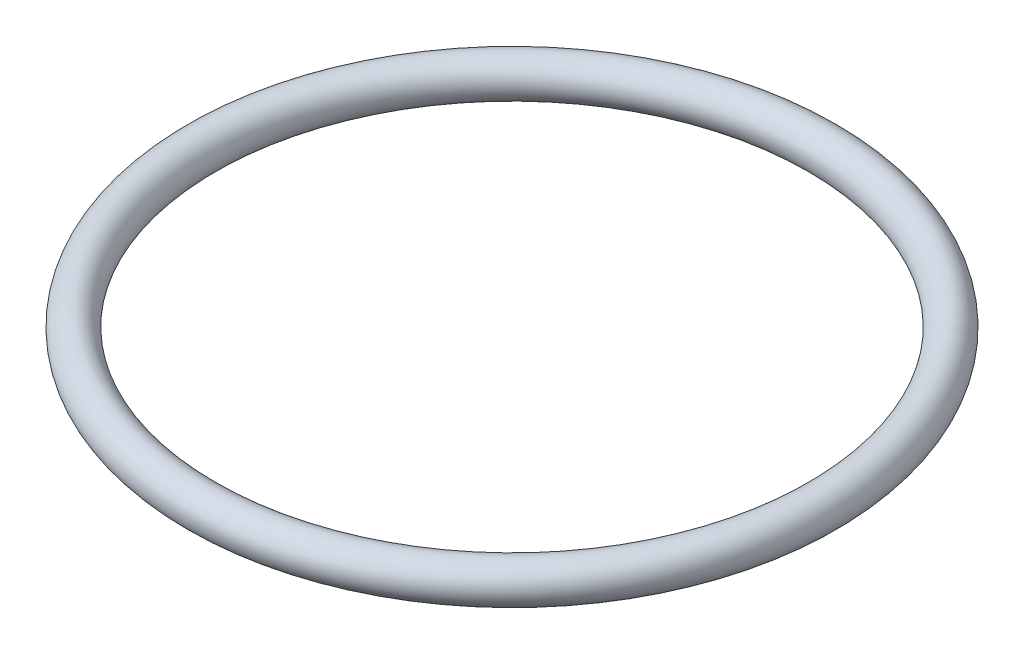
ISO-10303-21;
HEADER;
FILE_DESCRIPTION(('STEP AP214'),'2;1');
FILE_NAME('part.step','',(''),(''),'','','');
FILE_SCHEMA(('AUTOMOTIVE_DESIGN { 1 0 10303 214 1 1 1 1 }'));
ENDSEC;
DATA;
#1=APPLICATION_CONTEXT('core data for automotive mechanical design processes');
#2=APPLICATION_PROTOCOL_DEFINITION('international standard','automotive_design',2000,#1);
#3=PRODUCT_CONTEXT('',#1,'mechanical');
#4=PRODUCT('Part','Part','',(#3));
#5=PRODUCT_RELATED_PRODUCT_CATEGORY('part','',(#4));
#6=PRODUCT_DEFINITION_FORMATION('','',#4);
#7=PRODUCT_DEFINITION_CONTEXT('part definition',#1,'design');
#8=PRODUCT_DEFINITION('design','',#6,#7);
#9=PRODUCT_DEFINITION_SHAPE('','',#8);
#10=(LENGTH_UNIT() NAMED_UNIT(*) SI_UNIT(.MILLI.,.METRE.));
#11=(NAMED_UNIT(*) PLANE_ANGLE_UNIT() SI_UNIT($,.RADIAN.));
#12=(NAMED_UNIT(*) SI_UNIT($,.STERADIAN.) SOLID_ANGLE_UNIT());
#13=UNCERTAINTY_MEASURE_WITH_UNIT(LENGTH_MEASURE(1.E-05),#10,'distance_accuracy_value','');
#14=(GEOMETRIC_REPRESENTATION_CONTEXT(3) GLOBAL_UNCERTAINTY_ASSIGNED_CONTEXT((#13)) GLOBAL_UNIT_ASSIGNED_CONTEXT((#10,
#11,#12)) REPRESENTATION_CONTEXT('',''));
#15=CARTESIAN_POINT('',(0.,0.,0.));
#16=DIRECTION('',(0.,0.,1.));
#17=DIRECTION('',(1.,0.,0.));
#18=AXIS2_PLACEMENT_3D('',#15,#16,#17);
#19=CARTESIAN_POINT('',(0.,0.,0.));
#20=DIRECTION('',(0.,1.,0.));
#21=DIRECTION('',(0.,0.,1.));
#22=AXIS2_PLACEMENT_3D('',#19,#20,#21);
#23=TOROIDAL_SURFACE('',#22,8.,0.500000000000001);
#24=CARTESIAN_POINT('',(0.,0.,8.5));
#25=VERTEX_POINT('',#24);
#26=VERTEX_LOOP('',#25);
#27=FACE_BOUND('',#26,.T.);
#28=ADVANCED_FACE('F29',(#27),#23,.T.);
#29=CLOSED_SHELL('',(#28));
#30=MANIFOLD_SOLID_BREP('B2',#29);
#31=ADVANCED_BREP_SHAPE_REPRESENTATION('',(#18,#30),#14);
#32=SHAPE_DEFINITION_REPRESENTATION(#9,#31);
ENDSEC;
END-ISO-10303-21;
